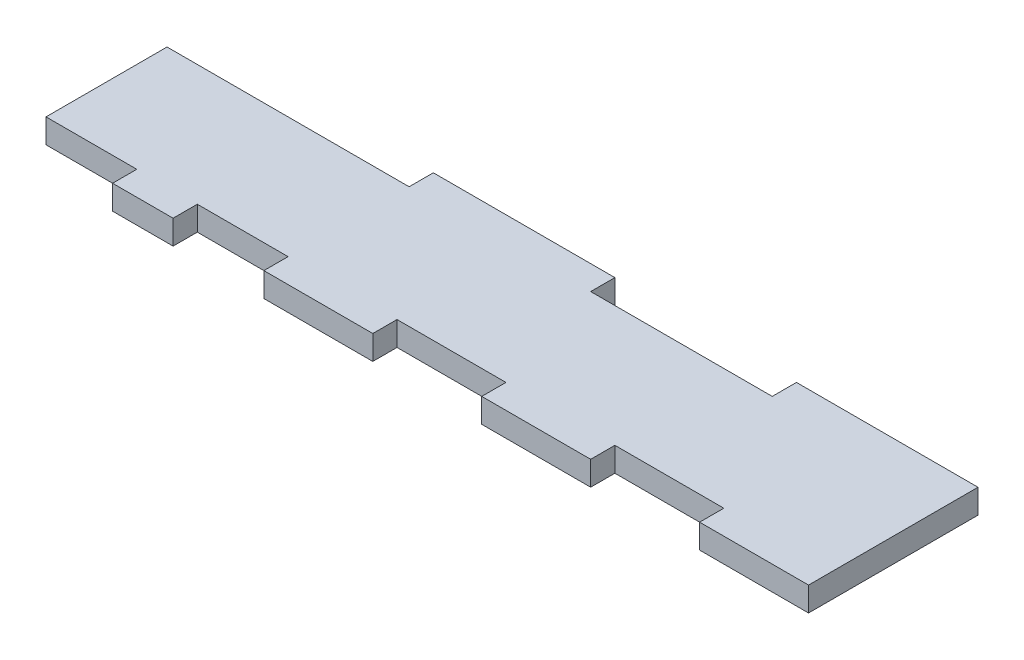
ISO-10303-21;
HEADER;
FILE_DESCRIPTION(('STEP AP214'),'2;1');
FILE_NAME('part.step','',(''),(''),'','','');
FILE_SCHEMA(('AUTOMOTIVE_DESIGN { 1 0 10303 214 1 1 1 1 }'));
ENDSEC;
DATA;
#1=APPLICATION_CONTEXT('core data for automotive mechanical design processes');
#2=APPLICATION_PROTOCOL_DEFINITION('international standard','automotive_design',2000,#1);
#3=PRODUCT_CONTEXT('',#1,'mechanical');
#4=PRODUCT('Part','Part','',(#3));
#5=PRODUCT_RELATED_PRODUCT_CATEGORY('part','',(#4));
#6=PRODUCT_DEFINITION_FORMATION('','',#4);
#7=PRODUCT_DEFINITION_CONTEXT('part definition',#1,'design');
#8=PRODUCT_DEFINITION('design','',#6,#7);
#9=PRODUCT_DEFINITION_SHAPE('','',#8);
#10=(LENGTH_UNIT() NAMED_UNIT(*) SI_UNIT(.MILLI.,.METRE.));
#11=(NAMED_UNIT(*) PLANE_ANGLE_UNIT() SI_UNIT($,.RADIAN.));
#12=(NAMED_UNIT(*) SI_UNIT($,.STERADIAN.) SOLID_ANGLE_UNIT());
#13=UNCERTAINTY_MEASURE_WITH_UNIT(LENGTH_MEASURE(1.E-05),#10,'distance_accuracy_value','');
#14=(GEOMETRIC_REPRESENTATION_CONTEXT(3) GLOBAL_UNCERTAINTY_ASSIGNED_CONTEXT((#13)) GLOBAL_UNIT_ASSIGNED_CONTEXT((#10,
#11,#12)) REPRESENTATION_CONTEXT('',''));
#15=CARTESIAN_POINT('',(0.,0.,0.));
#16=DIRECTION('',(0.,0.,1.));
#17=DIRECTION('',(1.,0.,0.));
#18=AXIS2_PLACEMENT_3D('',#15,#16,#17);
#19=CARTESIAN_POINT('',(65.,2.,-14.));
#20=DIRECTION('',(0.,0.,1.));
#21=DIRECTION('',(1.,0.,0.));
#22=AXIS2_PLACEMENT_3D('',#19,#20,#21);
#23=PLANE('',#22);
#24=DIRECTION('',(-1.,0.,0.));
#25=VECTOR('',#24,1.);
#26=CARTESIAN_POINT('',(65.,-2.,-14.));
#27=LINE('',#26,#25);
#28=CARTESIAN_POINT('',(65.,-2.,-14.));
#29=VERTEX_POINT('',#28);
#30=CARTESIAN_POINT('',(35.,-2.,-14.));
#31=VERTEX_POINT('',#30);
#32=EDGE_CURVE('E240',#29,#31,#27,.T.);
#33=ORIENTED_EDGE('',*,*,#32,.T.);
#34=DIRECTION('',(0.,-1.,0.));
#35=VECTOR('',#34,1.);
#36=CARTESIAN_POINT('',(35.,2.,-14.));
#37=LINE('',#36,#35);
#38=CARTESIAN_POINT('',(35.,2.,-14.));
#39=VERTEX_POINT('',#38);
#40=EDGE_CURVE('E52',#39,#31,#37,.T.);
#41=ORIENTED_EDGE('',*,*,#40,.F.);
#42=DIRECTION('',(-1.,0.,0.));
#43=VECTOR('',#42,1.);
#44=CARTESIAN_POINT('',(65.,2.,-14.));
#45=LINE('',#44,#43);
#46=CARTESIAN_POINT('',(65.,2.,-14.));
#47=VERTEX_POINT('',#46);
#48=EDGE_CURVE('E151',#47,#39,#45,.T.);
#49=ORIENTED_EDGE('',*,*,#48,.F.);
#50=DIRECTION('',(0.,-1.,0.));
#51=VECTOR('',#50,1.);
#52=CARTESIAN_POINT('',(65.,2.,-14.));
#53=LINE('',#52,#51);
#54=EDGE_CURVE('E11',#47,#29,#53,.T.);
#55=ORIENTED_EDGE('',*,*,#54,.T.);
#56=EDGE_LOOP('',(#33,#41,#49,#55));
#57=FACE_BOUND('',#56,.T.);
#58=ADVANCED_FACE('F44',(#57),#23,.F.);
#59=CARTESIAN_POINT('',(35.,2.,-10.));
#60=DIRECTION('',(1.,0.,0.));
#61=DIRECTION('',(0.,0.,-1.));
#62=AXIS2_PLACEMENT_3D('',#59,#60,#61);
#63=PLANE('',#62);
#64=DIRECTION('',(0.,0.,1.));
#65=VECTOR('',#64,1.);
#66=CARTESIAN_POINT('',(35.,-2.,-10.));
#67=LINE('',#66,#65);
#68=CARTESIAN_POINT('',(35.,-2.,-10.));
#69=VERTEX_POINT('',#68);
#70=EDGE_CURVE('E242',#31,#69,#67,.T.);
#71=ORIENTED_EDGE('',*,*,#70,.T.);
#72=DIRECTION('',(0.,-1.,0.));
#73=VECTOR('',#72,1.);
#74=CARTESIAN_POINT('',(35.,2.,-10.));
#75=LINE('',#74,#73);
#76=CARTESIAN_POINT('',(35.,2.,-10.));
#77=VERTEX_POINT('',#76);
#78=EDGE_CURVE('E338',#77,#69,#75,.T.);
#79=ORIENTED_EDGE('',*,*,#78,.F.);
#80=DIRECTION('',(0.,0.,1.));
#81=VECTOR('',#80,1.);
#82=CARTESIAN_POINT('',(35.,2.,-10.));
#83=LINE('',#82,#81);
#84=EDGE_CURVE('E346',#39,#77,#83,.T.);
#85=ORIENTED_EDGE('',*,*,#84,.F.);
#86=ORIENTED_EDGE('',*,*,#40,.T.);
#87=EDGE_LOOP('',(#71,#79,#85,#86));
#88=FACE_BOUND('',#87,.T.);
#89=ADVANCED_FACE('F344',(#88),#63,.F.);
#90=CARTESIAN_POINT('',(5.00000000000002,2.,-10.));
#91=DIRECTION('',(0.,0.,1.));
#92=DIRECTION('',(1.,0.,0.));
#93=AXIS2_PLACEMENT_3D('',#90,#91,#92);
#94=PLANE('',#93);
#95=DIRECTION('',(-1.,0.,0.));
#96=VECTOR('',#95,1.);
#97=CARTESIAN_POINT('',(5.00000000000002,-2.,-10.));
#98=LINE('',#97,#96);
#99=CARTESIAN_POINT('',(5.00000000000002,-2.,-10.));
#100=VERTEX_POINT('',#99);
#101=EDGE_CURVE('E245',#69,#100,#98,.T.);
#102=ORIENTED_EDGE('',*,*,#101,.T.);
#103=DIRECTION('',(0.,-1.,0.));
#104=VECTOR('',#103,1.);
#105=CARTESIAN_POINT('',(5.00000000000002,2.,-10.));
#106=LINE('',#105,#104);
#107=CARTESIAN_POINT('',(5.00000000000002,2.,-10.));
#108=VERTEX_POINT('',#107);
#109=EDGE_CURVE('E335',#108,#100,#106,.T.);
#110=ORIENTED_EDGE('',*,*,#109,.F.);
#111=DIRECTION('',(-1.,0.,0.));
#112=VECTOR('',#111,1.);
#113=CARTESIAN_POINT('',(5.00000000000002,2.,-10.));
#114=LINE('',#113,#112);
#115=EDGE_CURVE('E363',#77,#108,#114,.T.);
#116=ORIENTED_EDGE('',*,*,#115,.F.);
#117=ORIENTED_EDGE('',*,*,#78,.T.);
#118=EDGE_LOOP('',(#102,#110,#116,#117));
#119=FACE_BOUND('',#118,.T.);
#120=ADVANCED_FACE('F354',(#119),#94,.F.);
#121=CARTESIAN_POINT('',(5.00000000000002,2.,-10.));
#122=DIRECTION('',(-1.,0.,0.));
#123=DIRECTION('',(0.,0.,1.));
#124=AXIS2_PLACEMENT_3D('',#121,#122,#123);
#125=PLANE('',#124);
#126=DIRECTION('',(0.,0.,-1.));
#127=VECTOR('',#126,1.);
#128=CARTESIAN_POINT('',(5.00000000000002,-2.,-10.));
#129=LINE('',#128,#127);
#130=CARTESIAN_POINT('',(5.00000000000002,-2.,-14.));
#131=VERTEX_POINT('',#130);
#132=EDGE_CURVE('E247',#100,#131,#129,.T.);
#133=ORIENTED_EDGE('',*,*,#132,.T.);
#134=DIRECTION('',(0.,-1.,0.));
#135=VECTOR('',#134,1.);
#136=CARTESIAN_POINT('',(5.00000000000002,2.,-14.));
#137=LINE('',#136,#135);
#138=CARTESIAN_POINT('',(5.00000000000002,2.,-14.));
#139=VERTEX_POINT('',#138);
#140=EDGE_CURVE('E332',#139,#131,#137,.T.);
#141=ORIENTED_EDGE('',*,*,#140,.F.);
#142=DIRECTION('',(0.,0.,-1.));
#143=VECTOR('',#142,1.);
#144=CARTESIAN_POINT('',(5.00000000000002,2.,-10.));
#145=LINE('',#144,#143);
#146=EDGE_CURVE('E360',#108,#139,#145,.T.);
#147=ORIENTED_EDGE('',*,*,#146,.F.);
#148=ORIENTED_EDGE('',*,*,#109,.T.);
#149=EDGE_LOOP('',(#133,#141,#147,#148));
#150=FACE_BOUND('',#149,.T.);
#151=ADVANCED_FACE('F358',(#150),#125,.F.);
#152=CARTESIAN_POINT('',(5.00000000000002,2.,-14.));
#153=DIRECTION('',(0.,0.,1.));
#154=DIRECTION('',(1.,0.,0.));
#155=AXIS2_PLACEMENT_3D('',#152,#153,#154);
#156=PLANE('',#155);
#157=DIRECTION('',(-1.,0.,0.));
#158=VECTOR('',#157,1.);
#159=CARTESIAN_POINT('',(5.00000000000002,-2.,-14.));
#160=LINE('',#159,#158);
#161=CARTESIAN_POINT('',(-25.,-2.,-14.));
#162=VERTEX_POINT('',#161);
#163=EDGE_CURVE('E249',#131,#162,#160,.T.);
#164=ORIENTED_EDGE('',*,*,#163,.T.);
#165=DIRECTION('',(0.,-1.,0.));
#166=VECTOR('',#165,1.);
#167=CARTESIAN_POINT('',(-25.,2.,-14.));
#168=LINE('',#167,#166);
#169=CARTESIAN_POINT('',(-25.,2.,-14.));
#170=VERTEX_POINT('',#169);
#171=EDGE_CURVE('E329',#170,#162,#168,.T.);
#172=ORIENTED_EDGE('',*,*,#171,.F.);
#173=DIRECTION('',(-1.,0.,0.));
#174=VECTOR('',#173,1.);
#175=CARTESIAN_POINT('',(5.00000000000002,2.,-14.));
#176=LINE('',#175,#174);
#177=EDGE_CURVE('E362',#139,#170,#176,.T.);
#178=ORIENTED_EDGE('',*,*,#177,.F.);
#179=ORIENTED_EDGE('',*,*,#140,.T.);
#180=EDGE_LOOP('',(#164,#172,#178,#179));
#181=FACE_BOUND('',#180,.T.);
#182=ADVANCED_FACE('F421',(#181),#156,.F.);
#183=CARTESIAN_POINT('',(-25.,2.,-10.));
#184=DIRECTION('',(1.,0.,0.));
#185=DIRECTION('',(0.,0.,-1.));
#186=AXIS2_PLACEMENT_3D('',#183,#184,#185);
#187=PLANE('',#186);
#188=DIRECTION('',(0.,0.,1.));
#189=VECTOR('',#188,1.);
#190=CARTESIAN_POINT('',(-25.,-2.,-10.));
#191=LINE('',#190,#189);
#192=CARTESIAN_POINT('',(-25.,-2.,-10.));
#193=VERTEX_POINT('',#192);
#194=EDGE_CURVE('E251',#162,#193,#191,.T.);
#195=ORIENTED_EDGE('',*,*,#194,.T.);
#196=DIRECTION('',(0.,-1.,0.));
#197=VECTOR('',#196,1.);
#198=CARTESIAN_POINT('',(-25.,2.,-10.));
#199=LINE('',#198,#197);
#200=CARTESIAN_POINT('',(-25.,2.,-10.));
#201=VERTEX_POINT('',#200);
#202=EDGE_CURVE('E326',#201,#193,#199,.T.);
#203=ORIENTED_EDGE('',*,*,#202,.F.);
#204=DIRECTION('',(0.,0.,1.));
#205=VECTOR('',#204,1.);
#206=CARTESIAN_POINT('',(-25.,2.,-10.));
#207=LINE('',#206,#205);
#208=EDGE_CURVE('E365',#170,#201,#207,.T.);
#209=ORIENTED_EDGE('',*,*,#208,.F.);
#210=ORIENTED_EDGE('',*,*,#171,.T.);
#211=EDGE_LOOP('',(#195,#203,#209,#210));
#212=FACE_BOUND('',#211,.T.);
#213=ADVANCED_FACE('F424',(#212),#187,.F.);
#214=CARTESIAN_POINT('',(-55.,2.,-10.));
#215=DIRECTION('',(0.,0.,1.));
#216=DIRECTION('',(1.,0.,0.));
#217=AXIS2_PLACEMENT_3D('',#214,#215,#216);
#218=PLANE('',#217);
#219=DIRECTION('',(-1.,0.,0.));
#220=VECTOR('',#219,1.);
#221=CARTESIAN_POINT('',(-55.,-2.,-10.));
#222=LINE('',#221,#220);
#223=CARTESIAN_POINT('',(-65.,-2.,-10.));
#224=VERTEX_POINT('',#223);
#225=EDGE_CURVE('E253',#193,#224,#222,.T.);
#226=ORIENTED_EDGE('',*,*,#225,.T.);
#227=DIRECTION('',(0.,1.,0.));
#228=VECTOR('',#227,1.);
#229=CARTESIAN_POINT('',(-65.,-2.,-10.));
#230=LINE('',#229,#228);
#231=CARTESIAN_POINT('',(-65.,2.,-10.));
#232=VERTEX_POINT('',#231);
#233=EDGE_CURVE('E243',#224,#232,#230,.T.);
#234=ORIENTED_EDGE('',*,*,#233,.T.);
#235=DIRECTION('',(-1.,0.,0.));
#236=VECTOR('',#235,1.);
#237=CARTESIAN_POINT('',(-55.,2.,-10.));
#238=LINE('',#237,#236);
#239=EDGE_CURVE('E371',#201,#232,#238,.T.);
#240=ORIENTED_EDGE('',*,*,#239,.F.);
#241=ORIENTED_EDGE('',*,*,#202,.T.);
#242=EDGE_LOOP('',(#226,#234,#240,#241));
#243=FACE_BOUND('',#242,.T.);
#244=ADVANCED_FACE('F428',(#243),#218,.F.);
#245=CARTESIAN_POINT('',(-65.,2.,10.));
#246=DIRECTION('',(1.,0.,0.));
#247=DIRECTION('',(0.,0.,-1.));
#248=AXIS2_PLACEMENT_3D('',#245,#246,#247);
#249=PLANE('',#248);
#250=DIRECTION('',(0.,0.,1.));
#251=VECTOR('',#250,1.);
#252=CARTESIAN_POINT('',(-65.,2.,-10.));
#253=LINE('',#252,#251);
#254=CARTESIAN_POINT('',(-65.,2.,10.));
#255=VERTEX_POINT('',#254);
#256=EDGE_CURVE('E373',#232,#255,#253,.T.);
#257=ORIENTED_EDGE('',*,*,#256,.F.);
#258=ORIENTED_EDGE('',*,*,#233,.F.);
#259=DIRECTION('',(0.,0.,1.));
#260=VECTOR('',#259,1.);
#261=CARTESIAN_POINT('',(-65.,-2.,10.));
#262=LINE('',#261,#260);
#263=CARTESIAN_POINT('',(-65.,-2.,10.));
#264=VERTEX_POINT('',#263);
#265=EDGE_CURVE('E256',#224,#264,#262,.T.);
#266=ORIENTED_EDGE('',*,*,#265,.T.);
#267=DIRECTION('',(0.,-1.,0.));
#268=VECTOR('',#267,1.);
#269=CARTESIAN_POINT('',(-65.,2.,10.));
#270=LINE('',#269,#268);
#271=EDGE_CURVE('E323',#255,#264,#270,.T.);
#272=ORIENTED_EDGE('',*,*,#271,.F.);
#273=EDGE_LOOP('',(#257,#258,#266,#272));
#274=FACE_BOUND('',#273,.T.);
#275=ADVANCED_FACE('F432',(#274),#249,.F.);
#276=CARTESIAN_POINT('',(-65.,2.,10.));
#277=DIRECTION('',(0.,0.,-1.));
#278=DIRECTION('',(-1.,0.,0.));
#279=AXIS2_PLACEMENT_3D('',#276,#277,#278);
#280=PLANE('',#279);
#281=DIRECTION('',(1.,0.,0.));
#282=VECTOR('',#281,1.);
#283=CARTESIAN_POINT('',(-65.,-2.,10.));
#284=LINE('',#283,#282);
#285=CARTESIAN_POINT('',(-50.,-2.,10.));
#286=VERTEX_POINT('',#285);
#287=EDGE_CURVE('E258',#264,#286,#284,.T.);
#288=ORIENTED_EDGE('',*,*,#287,.T.);
#289=DIRECTION('',(0.,-1.,0.));
#290=VECTOR('',#289,1.);
#291=CARTESIAN_POINT('',(-50.,2.,10.));
#292=LINE('',#291,#290);
#293=CARTESIAN_POINT('',(-50.,2.,10.));
#294=VERTEX_POINT('',#293);
#295=EDGE_CURVE('E320',#294,#286,#292,.T.);
#296=ORIENTED_EDGE('',*,*,#295,.F.);
#297=DIRECTION('',(1.,0.,0.));
#298=VECTOR('',#297,1.);
#299=CARTESIAN_POINT('',(-65.,2.,10.));
#300=LINE('',#299,#298);
#301=EDGE_CURVE('E375',#255,#294,#300,.T.);
#302=ORIENTED_EDGE('',*,*,#301,.F.);
#303=ORIENTED_EDGE('',*,*,#271,.T.);
#304=EDGE_LOOP('',(#288,#296,#302,#303));
#305=FACE_BOUND('',#304,.T.);
#306=ADVANCED_FACE('F436',(#305),#280,.F.);
#307=CARTESIAN_POINT('',(-50.,2.,14.));
#308=DIRECTION('',(1.,0.,0.));
#309=DIRECTION('',(0.,0.,-1.));
#310=AXIS2_PLACEMENT_3D('',#307,#308,#309);
#311=PLANE('',#310);
#312=DIRECTION('',(0.,0.,1.));
#313=VECTOR('',#312,1.);
#314=CARTESIAN_POINT('',(-50.,-2.,14.));
#315=LINE('',#314,#313);
#316=CARTESIAN_POINT('',(-50.,-2.,14.));
#317=VERTEX_POINT('',#316);
#318=EDGE_CURVE('E260',#286,#317,#315,.T.);
#319=ORIENTED_EDGE('',*,*,#318,.T.);
#320=DIRECTION('',(0.,-1.,0.));
#321=VECTOR('',#320,1.);
#322=CARTESIAN_POINT('',(-50.,2.,14.));
#323=LINE('',#322,#321);
#324=CARTESIAN_POINT('',(-50.,2.,14.));
#325=VERTEX_POINT('',#324);
#326=EDGE_CURVE('E317',#325,#317,#323,.T.);
#327=ORIENTED_EDGE('',*,*,#326,.F.);
#328=DIRECTION('',(0.,0.,1.));
#329=VECTOR('',#328,1.);
#330=CARTESIAN_POINT('',(-50.,2.,14.));
#331=LINE('',#330,#329);
#332=EDGE_CURVE('E377',#294,#325,#331,.T.);
#333=ORIENTED_EDGE('',*,*,#332,.F.);
#334=ORIENTED_EDGE('',*,*,#295,.T.);
#335=EDGE_LOOP('',(#319,#327,#333,#334));
#336=FACE_BOUND('',#335,.T.);
#337=ADVANCED_FACE('F440',(#336),#311,.F.);
#338=CARTESIAN_POINT('',(-50.,2.,14.));
#339=DIRECTION('',(0.,0.,-1.));
#340=DIRECTION('',(-1.,0.,0.));
#341=AXIS2_PLACEMENT_3D('',#338,#339,#340);
#342=PLANE('',#341);
#343=DIRECTION('',(1.,0.,0.));
#344=VECTOR('',#343,1.);
#345=CARTESIAN_POINT('',(-50.,-2.,14.));
#346=LINE('',#345,#344);
#347=CARTESIAN_POINT('',(-40.,-2.,14.));
#348=VERTEX_POINT('',#347);
#349=EDGE_CURVE('E262',#317,#348,#346,.T.);
#350=ORIENTED_EDGE('',*,*,#349,.T.);
#351=DIRECTION('',(0.,-1.,0.));
#352=VECTOR('',#351,1.);
#353=CARTESIAN_POINT('',(-40.,2.,14.));
#354=LINE('',#353,#352);
#355=CARTESIAN_POINT('',(-40.,2.,14.));
#356=VERTEX_POINT('',#355);
#357=EDGE_CURVE('E314',#356,#348,#354,.T.);
#358=ORIENTED_EDGE('',*,*,#357,.F.);
#359=DIRECTION('',(1.,0.,0.));
#360=VECTOR('',#359,1.);
#361=CARTESIAN_POINT('',(-50.,2.,14.));
#362=LINE('',#361,#360);
#363=EDGE_CURVE('E379',#325,#356,#362,.T.);
#364=ORIENTED_EDGE('',*,*,#363,.F.);
#365=ORIENTED_EDGE('',*,*,#326,.T.);
#366=EDGE_LOOP('',(#350,#358,#364,#365));
#367=FACE_BOUND('',#366,.T.);
#368=ADVANCED_FACE('F444',(#367),#342,.F.);
#369=CARTESIAN_POINT('',(-40.,2.,14.));
#370=DIRECTION('',(-1.,0.,0.));
#371=DIRECTION('',(0.,0.,1.));
#372=AXIS2_PLACEMENT_3D('',#369,#370,#371);
#373=PLANE('',#372);
#374=DIRECTION('',(0.,0.,-1.));
#375=VECTOR('',#374,1.);
#376=CARTESIAN_POINT('',(-40.,-2.,14.));
#377=LINE('',#376,#375);
#378=CARTESIAN_POINT('',(-40.,-2.,10.));
#379=VERTEX_POINT('',#378);
#380=EDGE_CURVE('E264',#348,#379,#377,.T.);
#381=ORIENTED_EDGE('',*,*,#380,.T.);
#382=DIRECTION('',(0.,-1.,0.));
#383=VECTOR('',#382,1.);
#384=CARTESIAN_POINT('',(-40.,2.,10.));
#385=LINE('',#384,#383);
#386=CARTESIAN_POINT('',(-40.,2.,10.));
#387=VERTEX_POINT('',#386);
#388=EDGE_CURVE('E311',#387,#379,#385,.T.);
#389=ORIENTED_EDGE('',*,*,#388,.F.);
#390=DIRECTION('',(0.,0.,-1.));
#391=VECTOR('',#390,1.);
#392=CARTESIAN_POINT('',(-40.,2.,14.));
#393=LINE('',#392,#391);
#394=EDGE_CURVE('E381',#356,#387,#393,.T.);
#395=ORIENTED_EDGE('',*,*,#394,.F.);
#396=ORIENTED_EDGE('',*,*,#357,.T.);
#397=EDGE_LOOP('',(#381,#389,#395,#396));
#398=FACE_BOUND('',#397,.T.);
#399=ADVANCED_FACE('F448',(#398),#373,.F.);
#400=CARTESIAN_POINT('',(-40.,2.,10.));
#401=DIRECTION('',(0.,0.,-1.));
#402=DIRECTION('',(-1.,0.,0.));
#403=AXIS2_PLACEMENT_3D('',#400,#401,#402);
#404=PLANE('',#403);
#405=DIRECTION('',(1.,0.,0.));
#406=VECTOR('',#405,1.);
#407=CARTESIAN_POINT('',(-40.,-2.,10.));
#408=LINE('',#407,#406);
#409=CARTESIAN_POINT('',(-25.,-2.,10.));
#410=VERTEX_POINT('',#409);
#411=EDGE_CURVE('E266',#379,#410,#408,.T.);
#412=ORIENTED_EDGE('',*,*,#411,.T.);
#413=DIRECTION('',(0.,-1.,0.));
#414=VECTOR('',#413,1.);
#415=CARTESIAN_POINT('',(-25.,2.,10.));
#416=LINE('',#415,#414);
#417=CARTESIAN_POINT('',(-25.,2.,10.));
#418=VERTEX_POINT('',#417);
#419=EDGE_CURVE('E308',#418,#410,#416,.T.);
#420=ORIENTED_EDGE('',*,*,#419,.F.);
#421=DIRECTION('',(1.,0.,0.));
#422=VECTOR('',#421,1.);
#423=CARTESIAN_POINT('',(-40.,2.,10.));
#424=LINE('',#423,#422);
#425=EDGE_CURVE('E383',#387,#418,#424,.T.);
#426=ORIENTED_EDGE('',*,*,#425,.F.);
#427=ORIENTED_EDGE('',*,*,#388,.T.);
#428=EDGE_LOOP('',(#412,#420,#426,#427));
#429=FACE_BOUND('',#428,.T.);
#430=ADVANCED_FACE('F452',(#429),#404,.F.);
#431=CARTESIAN_POINT('',(-25.,2.,10.));
#432=DIRECTION('',(1.,0.,0.));
#433=DIRECTION('',(0.,0.,-1.));
#434=AXIS2_PLACEMENT_3D('',#431,#432,#433);
#435=PLANE('',#434);
#436=DIRECTION('',(0.,0.,1.));
#437=VECTOR('',#436,1.);
#438=CARTESIAN_POINT('',(-25.,-2.,10.));
#439=LINE('',#438,#437);
#440=CARTESIAN_POINT('',(-25.,-2.,14.0000000000006));
#441=VERTEX_POINT('',#440);
#442=EDGE_CURVE('E268',#410,#441,#439,.T.);
#443=ORIENTED_EDGE('',*,*,#442,.T.);
#444=DIRECTION('',(0.,-1.,0.));
#445=VECTOR('',#444,1.);
#446=CARTESIAN_POINT('',(-25.,2.,14.0000000000006));
#447=LINE('',#446,#445);
#448=CARTESIAN_POINT('',(-25.,2.,14.0000000000006));
#449=VERTEX_POINT('',#448);
#450=EDGE_CURVE('E305',#449,#441,#447,.T.);
#451=ORIENTED_EDGE('',*,*,#450,.F.);
#452=DIRECTION('',(0.,0.,1.));
#453=VECTOR('',#452,1.);
#454=CARTESIAN_POINT('',(-25.,2.,10.));
#455=LINE('',#454,#453);
#456=EDGE_CURVE('E385',#418,#449,#455,.T.);
#457=ORIENTED_EDGE('',*,*,#456,.F.);
#458=ORIENTED_EDGE('',*,*,#419,.T.);
#459=EDGE_LOOP('',(#443,#451,#457,#458));
#460=FACE_BOUND('',#459,.T.);
#461=ADVANCED_FACE('F456',(#460),#435,.F.);
#462=CARTESIAN_POINT('',(-6.99999999999999,2.,14.0000000000005));
#463=DIRECTION('',(0.,0.,-1.));
#464=DIRECTION('',(-1.,0.,0.));
#465=AXIS2_PLACEMENT_3D('',#462,#463,#464);
#466=PLANE('',#465);
#467=DIRECTION('',(1.,0.,0.));
#468=VECTOR('',#467,1.);
#469=CARTESIAN_POINT('',(-6.99999999999999,-2.,14.0000000000005));
#470=LINE('',#469,#468);
#471=CARTESIAN_POINT('',(-6.99999999999999,-2.,14.0000000000005));
#472=VERTEX_POINT('',#471);
#473=EDGE_CURVE('E270',#441,#472,#470,.T.);
#474=ORIENTED_EDGE('',*,*,#473,.T.);
#475=DIRECTION('',(0.,-1.,0.));
#476=VECTOR('',#475,1.);
#477=CARTESIAN_POINT('',(-6.99999999999999,2.,14.0000000000005));
#478=LINE('',#477,#476);
#479=CARTESIAN_POINT('',(-6.99999999999999,2.,14.0000000000005));
#480=VERTEX_POINT('',#479);
#481=EDGE_CURVE('E302',#480,#472,#478,.T.);
#482=ORIENTED_EDGE('',*,*,#481,.F.);
#483=DIRECTION('',(1.,0.,0.));
#484=VECTOR('',#483,1.);
#485=CARTESIAN_POINT('',(-6.99999999999999,2.,14.0000000000005));
#486=LINE('',#485,#484);
#487=EDGE_CURVE('E387',#449,#480,#486,.T.);
#488=ORIENTED_EDGE('',*,*,#487,.F.);
#489=ORIENTED_EDGE('',*,*,#450,.T.);
#490=EDGE_LOOP('',(#474,#482,#488,#489));
#491=FACE_BOUND('',#490,.T.);
#492=ADVANCED_FACE('F460',(#491),#466,.F.);
#493=CARTESIAN_POINT('',(-6.99999999999998,2.,10.0000000000005));
#494=DIRECTION('',(-1.,0.,0.));
#495=DIRECTION('',(0.,0.,1.));
#496=AXIS2_PLACEMENT_3D('',#493,#494,#495);
#497=PLANE('',#496);
#498=DIRECTION('',(0.,0.,-1.));
#499=VECTOR('',#498,1.);
#500=CARTESIAN_POINT('',(-6.99999999999998,-2.,10.0000000000005));
#501=LINE('',#500,#499);
#502=CARTESIAN_POINT('',(-6.99999999999998,-2.,10.0000000000005));
#503=VERTEX_POINT('',#502);
#504=EDGE_CURVE('E272',#472,#503,#501,.T.);
#505=ORIENTED_EDGE('',*,*,#504,.T.);
#506=DIRECTION('',(0.,-1.,0.));
#507=VECTOR('',#506,1.);
#508=CARTESIAN_POINT('',(-6.99999999999998,2.,10.0000000000005));
#509=LINE('',#508,#507);
#510=CARTESIAN_POINT('',(-6.99999999999998,2.,10.0000000000005));
#511=VERTEX_POINT('',#510);
#512=EDGE_CURVE('E299',#511,#503,#509,.T.);
#513=ORIENTED_EDGE('',*,*,#512,.F.);
#514=DIRECTION('',(0.,0.,-1.));
#515=VECTOR('',#514,1.);
#516=CARTESIAN_POINT('',(-6.99999999999998,2.,10.0000000000005));
#517=LINE('',#516,#515);
#518=EDGE_CURVE('E389',#480,#511,#517,.T.);
#519=ORIENTED_EDGE('',*,*,#518,.F.);
#520=ORIENTED_EDGE('',*,*,#481,.T.);
#521=EDGE_LOOP('',(#505,#513,#519,#520));
#522=FACE_BOUND('',#521,.T.);
#523=ADVANCED_FACE('F464',(#522),#497,.F.);
#524=CARTESIAN_POINT('',(-6.99999999999998,2.,10.0000000000005));
#525=DIRECTION('',(0.,0.,-1.));
#526=DIRECTION('',(-1.,0.,0.));
#527=AXIS2_PLACEMENT_3D('',#524,#525,#526);
#528=PLANE('',#527);
#529=DIRECTION('',(1.,0.,0.));
#530=VECTOR('',#529,1.);
#531=CARTESIAN_POINT('',(-6.99999999999998,-2.,10.0000000000005));
#532=LINE('',#531,#530);
#533=CARTESIAN_POINT('',(11.,-2.,9.99999999999975));
#534=VERTEX_POINT('',#533);
#535=EDGE_CURVE('E274',#503,#534,#532,.T.);
#536=ORIENTED_EDGE('',*,*,#535,.T.);
#537=DIRECTION('',(0.,-1.,0.));
#538=VECTOR('',#537,1.);
#539=CARTESIAN_POINT('',(11.,2.,9.99999999999975));
#540=LINE('',#539,#538);
#541=CARTESIAN_POINT('',(11.,2.,9.99999999999975));
#542=VERTEX_POINT('',#541);
#543=EDGE_CURVE('E296',#542,#534,#540,.T.);
#544=ORIENTED_EDGE('',*,*,#543,.F.);
#545=DIRECTION('',(1.,0.,0.));
#546=VECTOR('',#545,1.);
#547=CARTESIAN_POINT('',(-6.99999999999998,2.,10.0000000000005));
#548=LINE('',#547,#546);
#549=EDGE_CURVE('E391',#511,#542,#548,.T.);
#550=ORIENTED_EDGE('',*,*,#549,.F.);
#551=ORIENTED_EDGE('',*,*,#512,.T.);
#552=EDGE_LOOP('',(#536,#544,#550,#551));
#553=FACE_BOUND('',#552,.T.);
#554=ADVANCED_FACE('F468',(#553),#528,.F.);
#555=CARTESIAN_POINT('',(11.,2.,9.99999999999975));
#556=DIRECTION('',(1.,0.,0.));
#557=DIRECTION('',(0.,0.,-1.));
#558=AXIS2_PLACEMENT_3D('',#555,#556,#557);
#559=PLANE('',#558);
#560=DIRECTION('',(0.,0.,1.));
#561=VECTOR('',#560,1.);
#562=CARTESIAN_POINT('',(11.,-2.,9.99999999999975));
#563=LINE('',#562,#561);
#564=CARTESIAN_POINT('',(11.,-2.,14.0000000000004));
#565=VERTEX_POINT('',#564);
#566=EDGE_CURVE('E276',#534,#565,#563,.T.);
#567=ORIENTED_EDGE('',*,*,#566,.T.);
#568=DIRECTION('',(0.,-1.,0.));
#569=VECTOR('',#568,1.);
#570=CARTESIAN_POINT('',(11.,2.,14.0000000000004));
#571=LINE('',#570,#569);
#572=CARTESIAN_POINT('',(11.,2.,14.0000000000004));
#573=VERTEX_POINT('',#572);
#574=EDGE_CURVE('E293',#573,#565,#571,.T.);
#575=ORIENTED_EDGE('',*,*,#574,.F.);
#576=DIRECTION('',(0.,0.,1.));
#577=VECTOR('',#576,1.);
#578=CARTESIAN_POINT('',(11.,2.,9.99999999999975));
#579=LINE('',#578,#577);
#580=EDGE_CURVE('E393',#542,#573,#579,.T.);
#581=ORIENTED_EDGE('',*,*,#580,.F.);
#582=ORIENTED_EDGE('',*,*,#543,.T.);
#583=EDGE_LOOP('',(#567,#575,#581,#582));
#584=FACE_BOUND('',#583,.T.);
#585=ADVANCED_FACE('F472',(#584),#559,.F.);
#586=CARTESIAN_POINT('',(29.,2.,14.0000000000003));
#587=DIRECTION('',(0.,0.,-1.));
#588=DIRECTION('',(-1.,0.,0.));
#589=AXIS2_PLACEMENT_3D('',#586,#587,#588);
#590=PLANE('',#589);
#591=DIRECTION('',(1.,0.,0.));
#592=VECTOR('',#591,1.);
#593=CARTESIAN_POINT('',(29.,-2.,14.0000000000003));
#594=LINE('',#593,#592);
#595=CARTESIAN_POINT('',(29.,-2.,14.0000000000003));
#596=VERTEX_POINT('',#595);
#597=EDGE_CURVE('E278',#565,#596,#594,.T.);
#598=ORIENTED_EDGE('',*,*,#597,.T.);
#599=DIRECTION('',(0.,-1.,0.));
#600=VECTOR('',#599,1.);
#601=CARTESIAN_POINT('',(29.,2.,14.0000000000003));
#602=LINE('',#601,#600);
#603=CARTESIAN_POINT('',(29.,2.,14.0000000000003));
#604=VERTEX_POINT('',#603);
#605=EDGE_CURVE('E290',#604,#596,#602,.T.);
#606=ORIENTED_EDGE('',*,*,#605,.F.);
#607=DIRECTION('',(1.,0.,0.));
#608=VECTOR('',#607,1.);
#609=CARTESIAN_POINT('',(29.,2.,14.0000000000003));
#610=LINE('',#609,#608);
#611=EDGE_CURVE('E395',#573,#604,#610,.T.);
#612=ORIENTED_EDGE('',*,*,#611,.F.);
#613=ORIENTED_EDGE('',*,*,#574,.T.);
#614=EDGE_LOOP('',(#598,#606,#612,#613));
#615=FACE_BOUND('',#614,.T.);
#616=ADVANCED_FACE('F401',(#615),#590,.F.);
#617=CARTESIAN_POINT('',(29.,2.,10.0000000000003));
#618=DIRECTION('',(-1.,0.,0.));
#619=DIRECTION('',(0.,0.,1.));
#620=AXIS2_PLACEMENT_3D('',#617,#618,#619);
#621=PLANE('',#620);
#622=DIRECTION('',(0.,0.,-1.));
#623=VECTOR('',#622,1.);
#624=CARTESIAN_POINT('',(29.,-2.,10.0000000000003));
#625=LINE('',#624,#623);
#626=CARTESIAN_POINT('',(29.,-2.,10.0000000000003));
#627=VERTEX_POINT('',#626);
#628=EDGE_CURVE('E280',#596,#627,#625,.T.);
#629=ORIENTED_EDGE('',*,*,#628,.T.);
#630=DIRECTION('',(0.,-1.,0.));
#631=VECTOR('',#630,1.);
#632=CARTESIAN_POINT('',(29.,2.,10.0000000000003));
#633=LINE('',#632,#631);
#634=CARTESIAN_POINT('',(29.,2.,10.0000000000003));
#635=VERTEX_POINT('',#634);
#636=EDGE_CURVE('E229',#635,#627,#633,.T.);
#637=ORIENTED_EDGE('',*,*,#636,.F.);
#638=DIRECTION('',(0.,0.,-1.));
#639=VECTOR('',#638,1.);
#640=CARTESIAN_POINT('',(29.,2.,10.0000000000003));
#641=LINE('',#640,#639);
#642=EDGE_CURVE('E220',#604,#635,#641,.T.);
#643=ORIENTED_EDGE('',*,*,#642,.F.);
#644=ORIENTED_EDGE('',*,*,#605,.T.);
#645=EDGE_LOOP('',(#629,#637,#643,#644));
#646=FACE_BOUND('',#645,.T.);
#647=ADVANCED_FACE('F405',(#646),#621,.F.);
#648=CARTESIAN_POINT('',(29.,2.,10.0000000000003));
#649=DIRECTION('',(0.,0.,-1.));
#650=DIRECTION('',(-1.,0.,0.));
#651=AXIS2_PLACEMENT_3D('',#648,#649,#650);
#652=PLANE('',#651);
#653=DIRECTION('',(1.,0.,0.));
#654=VECTOR('',#653,1.);
#655=CARTESIAN_POINT('',(29.,-2.,10.0000000000003));
#656=LINE('',#655,#654);
#657=CARTESIAN_POINT('',(47.,-2.,9.9999999999995));
#658=VERTEX_POINT('',#657);
#659=EDGE_CURVE('E228',#627,#658,#656,.T.);
#660=ORIENTED_EDGE('',*,*,#659,.T.);
#661=DIRECTION('',(0.,-1.,0.));
#662=VECTOR('',#661,1.);
#663=CARTESIAN_POINT('',(47.,2.,9.9999999999995));
#664=LINE('',#663,#662);
#665=CARTESIAN_POINT('',(47.,2.,9.9999999999995));
#666=VERTEX_POINT('',#665);
#667=EDGE_CURVE('E225',#666,#658,#664,.T.);
#668=ORIENTED_EDGE('',*,*,#667,.F.);
#669=DIRECTION('',(1.,0.,0.));
#670=VECTOR('',#669,1.);
#671=CARTESIAN_POINT('',(29.,2.,10.0000000000003));
#672=LINE('',#671,#670);
#673=EDGE_CURVE('E213',#635,#666,#672,.T.);
#674=ORIENTED_EDGE('',*,*,#673,.F.);
#675=ORIENTED_EDGE('',*,*,#636,.T.);
#676=EDGE_LOOP('',(#660,#668,#674,#675));
#677=FACE_BOUND('',#676,.T.);
#678=ADVANCED_FACE('F226',(#677),#652,.F.);
#679=CARTESIAN_POINT('',(47.,2.,9.9999999999995));
#680=DIRECTION('',(1.,0.,0.));
#681=DIRECTION('',(0.,0.,-1.));
#682=AXIS2_PLACEMENT_3D('',#679,#680,#681);
#683=PLANE('',#682);
#684=DIRECTION('',(0.,0.,1.));
#685=VECTOR('',#684,1.);
#686=CARTESIAN_POINT('',(47.,-2.,9.9999999999995));
#687=LINE('',#686,#685);
#688=CARTESIAN_POINT('',(47.,-2.,14.0000000000001));
#689=VERTEX_POINT('',#688);
#690=EDGE_CURVE('E136',#658,#689,#687,.T.);
#691=ORIENTED_EDGE('',*,*,#690,.T.);
#692=DIRECTION('',(0.,-1.,0.));
#693=VECTOR('',#692,1.);
#694=CARTESIAN_POINT('',(47.,2.,14.0000000000001));
#695=LINE('',#694,#693);
#696=CARTESIAN_POINT('',(47.,2.,14.0000000000001));
#697=VERTEX_POINT('',#696);
#698=EDGE_CURVE('E230',#697,#689,#695,.T.);
#699=ORIENTED_EDGE('',*,*,#698,.F.);
#700=DIRECTION('',(0.,0.,1.));
#701=VECTOR('',#700,1.);
#702=CARTESIAN_POINT('',(47.,2.,9.9999999999995));
#703=LINE('',#702,#701);
#704=EDGE_CURVE('E218',#666,#697,#703,.T.);
#705=ORIENTED_EDGE('',*,*,#704,.F.);
#706=ORIENTED_EDGE('',*,*,#667,.T.);
#707=EDGE_LOOP('',(#691,#699,#705,#706));
#708=FACE_BOUND('',#707,.T.);
#709=ADVANCED_FACE('F232',(#708),#683,.F.);
#710=CARTESIAN_POINT('',(65.,2.,14.));
#711=DIRECTION('',(0.,0.,-1.));
#712=DIRECTION('',(-1.,0.,0.));
#713=AXIS2_PLACEMENT_3D('',#710,#711,#712);
#714=PLANE('',#713);
#715=DIRECTION('',(1.,0.,0.));
#716=VECTOR('',#715,1.);
#717=CARTESIAN_POINT('',(65.,-2.,14.));
#718=LINE('',#717,#716);
#719=CARTESIAN_POINT('',(65.,-2.,14.));
#720=VERTEX_POINT('',#719);
#721=EDGE_CURVE('E284',#689,#720,#718,.T.);
#722=ORIENTED_EDGE('',*,*,#721,.T.);
#723=DIRECTION('',(0.,-1.,0.));
#724=VECTOR('',#723,1.);
#725=CARTESIAN_POINT('',(65.,2.,14.));
#726=LINE('',#725,#724);
#727=CARTESIAN_POINT('',(65.,2.,14.));
#728=VERTEX_POINT('',#727);
#729=EDGE_CURVE('E236',#728,#720,#726,.T.);
#730=ORIENTED_EDGE('',*,*,#729,.F.);
#731=DIRECTION('',(1.,0.,0.));
#732=VECTOR('',#731,1.);
#733=CARTESIAN_POINT('',(65.,2.,14.));
#734=LINE('',#733,#732);
#735=EDGE_CURVE('E234',#697,#728,#734,.T.);
#736=ORIENTED_EDGE('',*,*,#735,.F.);
#737=ORIENTED_EDGE('',*,*,#698,.T.);
#738=EDGE_LOOP('',(#722,#730,#736,#737));
#739=FACE_BOUND('',#738,.T.);
#740=ADVANCED_FACE('F408',(#739),#714,.F.);
#741=CARTESIAN_POINT('',(65.,2.,10.));
#742=DIRECTION('',(-1.,0.,0.));
#743=DIRECTION('',(0.,0.,1.));
#744=AXIS2_PLACEMENT_3D('',#741,#742,#743);
#745=PLANE('',#744);
#746=DIRECTION('',(0.,0.,-1.));
#747=VECTOR('',#746,1.);
#748=CARTESIAN_POINT('',(65.,-2.,10.));
#749=LINE('',#748,#747);
#750=EDGE_CURVE('E143',#720,#29,#749,.T.);
#751=ORIENTED_EDGE('',*,*,#750,.T.);
#752=ORIENTED_EDGE('',*,*,#54,.F.);
#753=DIRECTION('',(0.,0.,-1.));
#754=VECTOR('',#753,1.);
#755=CARTESIAN_POINT('',(65.,2.,-10.));
#756=LINE('',#755,#754);
#757=EDGE_CURVE('E60',#728,#47,#756,.T.);
#758=ORIENTED_EDGE('',*,*,#757,.F.);
#759=ORIENTED_EDGE('',*,*,#729,.T.);
#760=EDGE_LOOP('',(#751,#752,#758,#759));
#761=FACE_BOUND('',#760,.T.);
#762=ADVANCED_FACE('F409',(#761),#745,.F.);
#763=CARTESIAN_POINT('',(0.,2.,0.));
#764=DIRECTION('',(0.,1.,0.));
#765=DIRECTION('',(0.,0.,1.));
#766=AXIS2_PLACEMENT_3D('',#763,#764,#765);
#767=PLANE('',#766);
#768=ORIENTED_EDGE('',*,*,#239,.T.);
#769=ORIENTED_EDGE('',*,*,#256,.T.);
#770=ORIENTED_EDGE('',*,*,#301,.T.);
#771=ORIENTED_EDGE('',*,*,#332,.T.);
#772=ORIENTED_EDGE('',*,*,#363,.T.);
#773=ORIENTED_EDGE('',*,*,#394,.T.);
#774=ORIENTED_EDGE('',*,*,#425,.T.);
#775=ORIENTED_EDGE('',*,*,#456,.T.);
#776=ORIENTED_EDGE('',*,*,#487,.T.);
#777=ORIENTED_EDGE('',*,*,#518,.T.);
#778=ORIENTED_EDGE('',*,*,#549,.T.);
#779=ORIENTED_EDGE('',*,*,#580,.T.);
#780=ORIENTED_EDGE('',*,*,#611,.T.);
#781=ORIENTED_EDGE('',*,*,#642,.T.);
#782=ORIENTED_EDGE('',*,*,#673,.T.);
#783=ORIENTED_EDGE('',*,*,#704,.T.);
#784=ORIENTED_EDGE('',*,*,#735,.T.);
#785=ORIENTED_EDGE('',*,*,#757,.T.);
#786=ORIENTED_EDGE('',*,*,#48,.T.);
#787=ORIENTED_EDGE('',*,*,#84,.T.);
#788=ORIENTED_EDGE('',*,*,#115,.T.);
#789=ORIENTED_EDGE('',*,*,#146,.T.);
#790=ORIENTED_EDGE('',*,*,#177,.T.);
#791=ORIENTED_EDGE('',*,*,#208,.T.);
#792=EDGE_LOOP('',(#768,#769,#770,#771,#772,#773,#774,#775,#776,#777,#778,#779,#780,#781,#782,
#783,#784,#785,#786,#787,#788,#789,#790,#791));
#793=FACE_BOUND('',#792,.T.);
#794=ADVANCED_FACE('F216',(#793),#767,.T.);
#795=CARTESIAN_POINT('',(0.,-2.,0.));
#796=DIRECTION('',(0.,1.,0.));
#797=DIRECTION('',(0.,0.,1.));
#798=AXIS2_PLACEMENT_3D('',#795,#796,#797);
#799=PLANE('',#798);
#800=ORIENTED_EDGE('',*,*,#265,.F.);
#801=ORIENTED_EDGE('',*,*,#225,.F.);
#802=ORIENTED_EDGE('',*,*,#194,.F.);
#803=ORIENTED_EDGE('',*,*,#163,.F.);
#804=ORIENTED_EDGE('',*,*,#132,.F.);
#805=ORIENTED_EDGE('',*,*,#101,.F.);
#806=ORIENTED_EDGE('',*,*,#70,.F.);
#807=ORIENTED_EDGE('',*,*,#32,.F.);
#808=ORIENTED_EDGE('',*,*,#750,.F.);
#809=ORIENTED_EDGE('',*,*,#721,.F.);
#810=ORIENTED_EDGE('',*,*,#690,.F.);
#811=ORIENTED_EDGE('',*,*,#659,.F.);
#812=ORIENTED_EDGE('',*,*,#628,.F.);
#813=ORIENTED_EDGE('',*,*,#597,.F.);
#814=ORIENTED_EDGE('',*,*,#566,.F.);
#815=ORIENTED_EDGE('',*,*,#535,.F.);
#816=ORIENTED_EDGE('',*,*,#504,.F.);
#817=ORIENTED_EDGE('',*,*,#473,.F.);
#818=ORIENTED_EDGE('',*,*,#442,.F.);
#819=ORIENTED_EDGE('',*,*,#411,.F.);
#820=ORIENTED_EDGE('',*,*,#380,.F.);
#821=ORIENTED_EDGE('',*,*,#349,.F.);
#822=ORIENTED_EDGE('',*,*,#318,.F.);
#823=ORIENTED_EDGE('',*,*,#287,.F.);
#824=EDGE_LOOP('',(#800,#801,#802,#803,#804,#805,#806,#807,#808,#809,#810,#811,#812,#813,#814,
#815,#816,#817,#818,#819,#820,#821,#822,#823));
#825=FACE_BOUND('',#824,.T.);
#826=ADVANCED_FACE('F349',(#825),#799,.F.);
#827=CLOSED_SHELL('',(#58,#89,#120,#151,#182,#213,#244,#275,#306,#337,#368,#399,#430,#461,#492,
#523,#554,#585,#616,#647,#678,#709,#740,#762,#794,#826));
#828=MANIFOLD_SOLID_BREP('B2',#827);
#829=ADVANCED_BREP_SHAPE_REPRESENTATION('',(#18,#828),#14);
#830=SHAPE_DEFINITION_REPRESENTATION(#9,#829);
ENDSEC;
END-ISO-10303-21;
